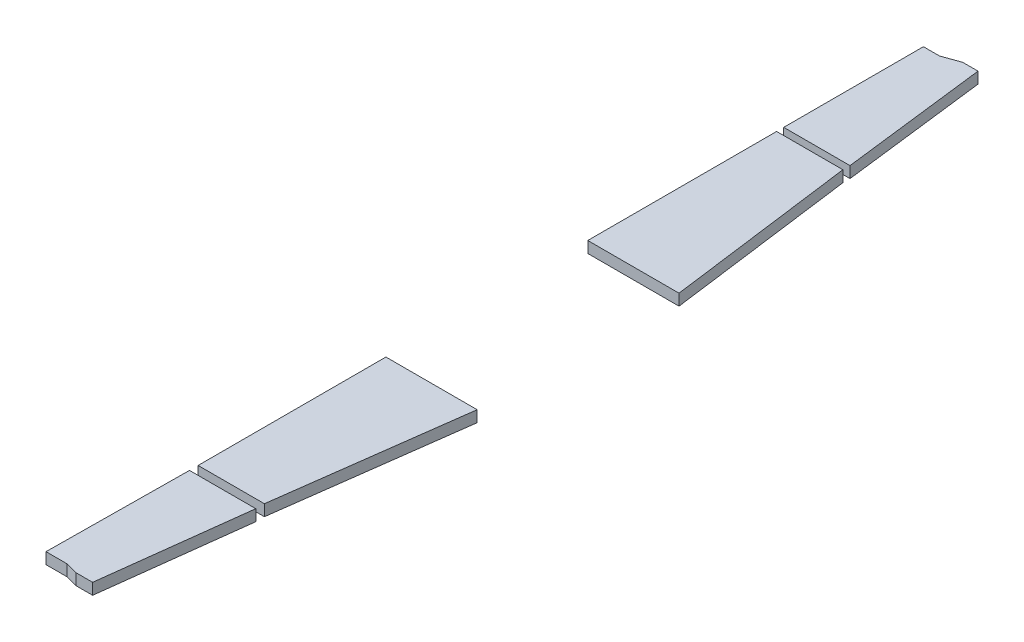
ISO-10303-21;
HEADER;
FILE_DESCRIPTION(('STEP AP214'),'2;1');
FILE_NAME('part.step','',(''),(''),'','','');
FILE_SCHEMA(('AUTOMOTIVE_DESIGN { 1 0 10303 214 1 1 1 1 }'));
ENDSEC;
DATA;
#1=APPLICATION_CONTEXT('core data for automotive mechanical design processes');
#2=APPLICATION_PROTOCOL_DEFINITION('international standard','automotive_design',2000,#1);
#3=PRODUCT_CONTEXT('',#1,'mechanical');
#4=PRODUCT('Part','Part','',(#3));
#5=PRODUCT_RELATED_PRODUCT_CATEGORY('part','',(#4));
#6=PRODUCT_DEFINITION_FORMATION('','',#4);
#7=PRODUCT_DEFINITION_CONTEXT('part definition',#1,'design');
#8=PRODUCT_DEFINITION('design','',#6,#7);
#9=PRODUCT_DEFINITION_SHAPE('','',#8);
#10=(LENGTH_UNIT() NAMED_UNIT(*) SI_UNIT(.MILLI.,.METRE.));
#11=(NAMED_UNIT(*) PLANE_ANGLE_UNIT() SI_UNIT($,.RADIAN.));
#12=(NAMED_UNIT(*) SI_UNIT($,.STERADIAN.) SOLID_ANGLE_UNIT());
#13=UNCERTAINTY_MEASURE_WITH_UNIT(LENGTH_MEASURE(1.E-05),#10,'distance_accuracy_value','');
#14=(GEOMETRIC_REPRESENTATION_CONTEXT(3) GLOBAL_UNCERTAINTY_ASSIGNED_CONTEXT((#13)) GLOBAL_UNIT_ASSIGNED_CONTEXT((#10,
#11,#12)) REPRESENTATION_CONTEXT('',''));
#15=CARTESIAN_POINT('',(0.,0.,0.));
#16=DIRECTION('',(0.,0.,1.));
#17=DIRECTION('',(1.,0.,0.));
#18=AXIS2_PLACEMENT_3D('',#15,#16,#17);
#19=CARTESIAN_POINT('',(1320.64914053354,304.8,10947.5154951929));
#20=DIRECTION('',(1.,0.,0.));
#21=DIRECTION('',(0.,0.,-1.));
#22=AXIS2_PLACEMENT_3D('',#19,#20,#21);
#23=PLANE('',#22);
#24=DIRECTION('',(0.,0.,1.));
#25=VECTOR('',#24,1.);
#26=CARTESIAN_POINT('',(1320.64914053354,0.,10947.5154951929));
#27=LINE('',#26,#25);
#28=CARTESIAN_POINT('',(1320.64914053354,0.,10947.5154951929));
#29=VERTEX_POINT('',#28);
#30=CARTESIAN_POINT('',(1320.64914053354,0.,16051.7646939314));
#31=VERTEX_POINT('',#30);
#32=EDGE_CURVE('E12',#29,#31,#27,.T.);
#33=ORIENTED_EDGE('',*,*,#32,.T.);
#34=DIRECTION('',(0.,-1.,0.));
#35=VECTOR('',#34,1.);
#36=CARTESIAN_POINT('',(1320.64914053354,304.8,16051.7646939314));
#37=LINE('',#36,#35);
#38=CARTESIAN_POINT('',(1320.64914053354,304.8,16051.7646939314));
#39=VERTEX_POINT('',#38);
#40=EDGE_CURVE('E171',#39,#31,#37,.T.);
#41=ORIENTED_EDGE('',*,*,#40,.F.);
#42=DIRECTION('',(0.,0.,1.));
#43=VECTOR('',#42,1.);
#44=CARTESIAN_POINT('',(1320.64914053354,304.8,10947.5154951929));
#45=LINE('',#44,#43);
#46=CARTESIAN_POINT('',(1320.64914053354,304.8,10947.5154951929));
#47=VERTEX_POINT('',#46);
#48=EDGE_CURVE('E100',#47,#39,#45,.T.);
#49=ORIENTED_EDGE('',*,*,#48,.F.);
#50=DIRECTION('',(0.,-1.,0.));
#51=VECTOR('',#50,1.);
#52=CARTESIAN_POINT('',(1320.64914053354,304.8,10947.5154951929));
#53=LINE('',#52,#51);
#54=EDGE_CURVE('E95',#47,#29,#53,.T.);
#55=ORIENTED_EDGE('',*,*,#54,.T.);
#56=EDGE_LOOP('',(#33,#41,#49,#55));
#57=FACE_BOUND('',#56,.T.);
#58=ADVANCED_FACE('F52',(#57),#23,.F.);
#59=CARTESIAN_POINT('',(1320.64914053354,304.8,16051.7646939314));
#60=DIRECTION('',(0.,0.,-1.));
#61=DIRECTION('',(-1.,0.,0.));
#62=AXIS2_PLACEMENT_3D('',#59,#60,#61);
#63=PLANE('',#62);
#64=DIRECTION('',(1.,0.,0.));
#65=VECTOR('',#64,1.);
#66=CARTESIAN_POINT('',(1320.64914053354,0.,16051.7646939314));
#67=LINE('',#66,#65);
#68=CARTESIAN_POINT('',(3787.29094804455,0.,16051.7646939314));
#69=VERTEX_POINT('',#68);
#70=EDGE_CURVE('E62',#31,#69,#67,.T.);
#71=ORIENTED_EDGE('',*,*,#70,.T.);
#72=DIRECTION('',(0.,-1.,0.));
#73=VECTOR('',#72,1.);
#74=CARTESIAN_POINT('',(3787.29094804455,304.8,16051.7646939314));
#75=LINE('',#74,#73);
#76=CARTESIAN_POINT('',(3787.29094804455,304.8,16051.7646939314));
#77=VERTEX_POINT('',#76);
#78=EDGE_CURVE('E160',#77,#69,#75,.T.);
#79=ORIENTED_EDGE('',*,*,#78,.F.);
#80=DIRECTION('',(1.,0.,0.));
#81=VECTOR('',#80,1.);
#82=CARTESIAN_POINT('',(1320.64914053354,304.8,16051.7646939314));
#83=LINE('',#82,#81);
#84=EDGE_CURVE('E165',#39,#77,#83,.T.);
#85=ORIENTED_EDGE('',*,*,#84,.F.);
#86=ORIENTED_EDGE('',*,*,#40,.T.);
#87=EDGE_LOOP('',(#71,#79,#85,#86));
#88=FACE_BOUND('',#87,.T.);
#89=ADVANCED_FACE('F112',(#88),#63,.F.);
#90=CARTESIAN_POINT('',(3787.29094804455,304.8,16051.7646939314));
#91=DIRECTION('',(-0.99136850616426,0.,0.131104862555301));
#92=DIRECTION('',(0.131104862555301,0.,0.99136850616426));
#93=AXIS2_PLACEMENT_3D('',#90,#91,#92);
#94=PLANE('',#93);
#95=DIRECTION('',(-0.131104862555301,0.,-0.99136850616426));
#96=VECTOR('',#95,1.);
#97=CARTESIAN_POINT('',(3787.29094804455,0.,16051.7646939314));
#98=LINE('',#97,#96);
#99=CARTESIAN_POINT('',(3112.27264204871,0.,10947.5154951929));
#100=VERTEX_POINT('',#99);
#101=EDGE_CURVE('E99',#69,#100,#98,.T.);
#102=ORIENTED_EDGE('',*,*,#101,.T.);
#103=DIRECTION('',(0.,-1.,0.));
#104=VECTOR('',#103,1.);
#105=CARTESIAN_POINT('',(3112.27264204871,304.8,10947.5154951929));
#106=LINE('',#105,#104);
#107=CARTESIAN_POINT('',(3112.27264204871,304.8,10947.5154951929));
#108=VERTEX_POINT('',#107);
#109=EDGE_CURVE('E98',#108,#100,#106,.T.);
#110=ORIENTED_EDGE('',*,*,#109,.F.);
#111=DIRECTION('',(-0.131104862555301,0.,-0.99136850616426));
#112=VECTOR('',#111,1.);
#113=CARTESIAN_POINT('',(3787.29094804455,304.8,16051.7646939314));
#114=LINE('',#113,#112);
#115=EDGE_CURVE('E168',#77,#108,#114,.T.);
#116=ORIENTED_EDGE('',*,*,#115,.F.);
#117=ORIENTED_EDGE('',*,*,#78,.T.);
#118=EDGE_LOOP('',(#102,#110,#116,#117));
#119=FACE_BOUND('',#118,.T.);
#120=ADVANCED_FACE('F117',(#119),#94,.F.);
#121=CARTESIAN_POINT('',(1320.64914053354,304.8,10947.5154951929));
#122=DIRECTION('',(0.,0.,1.));
#123=DIRECTION('',(1.,0.,0.));
#124=AXIS2_PLACEMENT_3D('',#121,#122,#123);
#125=PLANE('',#124);
#126=DIRECTION('',(-1.,0.,0.));
#127=VECTOR('',#126,1.);
#128=CARTESIAN_POINT('',(1320.64914053354,0.,10947.5154951929));
#129=LINE('',#128,#127);
#130=EDGE_CURVE('E91',#100,#29,#129,.T.);
#131=ORIENTED_EDGE('',*,*,#130,.T.);
#132=ORIENTED_EDGE('',*,*,#54,.F.);
#133=DIRECTION('',(-1.,0.,0.));
#134=VECTOR('',#133,1.);
#135=CARTESIAN_POINT('',(1320.64914053354,304.8,10947.5154951929));
#136=LINE('',#135,#134);
#137=EDGE_CURVE('E56',#108,#47,#136,.T.);
#138=ORIENTED_EDGE('',*,*,#137,.F.);
#139=ORIENTED_EDGE('',*,*,#109,.T.);
#140=EDGE_LOOP('',(#131,#132,#138,#139));
#141=FACE_BOUND('',#140,.T.);
#142=ADVANCED_FACE('F93',(#141),#125,.F.);
#143=CARTESIAN_POINT('',(0.,304.8,0.));
#144=DIRECTION('',(0.,1.,0.));
#145=DIRECTION('',(0.,0.,1.));
#146=AXIS2_PLACEMENT_3D('',#143,#144,#145);
#147=PLANE('',#146);
#148=ORIENTED_EDGE('',*,*,#48,.T.);
#149=ORIENTED_EDGE('',*,*,#84,.T.);
#150=ORIENTED_EDGE('',*,*,#115,.T.);
#151=ORIENTED_EDGE('',*,*,#137,.T.);
#152=EDGE_LOOP('',(#148,#149,#150,#151));
#153=FACE_BOUND('',#152,.T.);
#154=ADVANCED_FACE('F106',(#153),#147,.T.);
#155=CARTESIAN_POINT('',(0.,0.,0.));
#156=DIRECTION('',(0.,1.,0.));
#157=DIRECTION('',(0.,0.,1.));
#158=AXIS2_PLACEMENT_3D('',#155,#156,#157);
#159=PLANE('',#158);
#160=ORIENTED_EDGE('',*,*,#32,.F.);
#161=ORIENTED_EDGE('',*,*,#130,.F.);
#162=ORIENTED_EDGE('',*,*,#101,.F.);
#163=ORIENTED_EDGE('',*,*,#70,.F.);
#164=EDGE_LOOP('',(#160,#161,#162,#163));
#165=FACE_BOUND('',#164,.T.);
#166=ADVANCED_FACE('F54',(#165),#159,.F.);
#167=CLOSED_SHELL('',(#58,#89,#120,#142,#154,#166));
#168=MANIFOLD_SOLID_BREP('B2',#167);
#169=CARTESIAN_POINT('',(1320.64914053354,304.8,6979.23888497898));
#170=DIRECTION('',(1.,0.,0.));
#171=DIRECTION('',(0.,0.,-1.));
#172=AXIS2_PLACEMENT_3D('',#169,#170,#171);
#173=PLANE('',#172);
#174=DIRECTION('',(0.,0.,1.));
#175=VECTOR('',#174,1.);
#176=CARTESIAN_POINT('',(1320.64914053354,0.,6979.23888497898));
#177=LINE('',#176,#175);
#178=CARTESIAN_POINT('',(1320.64914053354,0.,6979.23888497898));
#179=VERTEX_POINT('',#178);
#180=CARTESIAN_POINT('',(1320.64914053354,0.,10754.9703962938));
#181=VERTEX_POINT('',#180);
#182=EDGE_CURVE('E263',#179,#181,#177,.T.);
#183=ORIENTED_EDGE('',*,*,#182,.T.);
#184=DIRECTION('',(0.,-1.,0.));
#185=VECTOR('',#184,1.);
#186=CARTESIAN_POINT('',(1320.64914053354,304.8,10754.9703962938));
#187=LINE('',#186,#185);
#188=CARTESIAN_POINT('',(1320.64914053354,304.8,10754.9703962938));
#189=VERTEX_POINT('',#188);
#190=EDGE_CURVE('E50',#189,#181,#187,.T.);
#191=ORIENTED_EDGE('',*,*,#190,.F.);
#192=DIRECTION('',(0.,0.,1.));
#193=VECTOR('',#192,1.);
#194=CARTESIAN_POINT('',(1320.64914053354,304.8,6979.23888497898));
#195=LINE('',#194,#193);
#196=CARTESIAN_POINT('',(1320.64914053354,304.8,6979.23888497898));
#197=VERTEX_POINT('',#196);
#198=EDGE_CURVE('E286',#197,#189,#195,.T.);
#199=ORIENTED_EDGE('',*,*,#198,.F.);
#200=DIRECTION('',(0.,-1.,0.));
#201=VECTOR('',#200,1.);
#202=CARTESIAN_POINT('',(1320.64914053354,304.8,6979.23888497898));
#203=LINE('',#202,#201);
#204=EDGE_CURVE('E285',#197,#179,#203,.T.);
#205=ORIENTED_EDGE('',*,*,#204,.T.);
#206=EDGE_LOOP('',(#183,#191,#199,#205));
#207=FACE_BOUND('',#206,.T.);
#208=ADVANCED_FACE('F186',(#207),#173,.F.);
#209=CARTESIAN_POINT('',(1320.64914053354,304.8,10754.9703962938));
#210=DIRECTION('',(0.,0.,-1.));
#211=DIRECTION('',(-1.,0.,0.));
#212=AXIS2_PLACEMENT_3D('',#209,#210,#211);
#213=PLANE('',#212);
#214=DIRECTION('',(1.,0.,0.));
#215=VECTOR('',#214,1.);
#216=CARTESIAN_POINT('',(1320.64914053354,0.,10754.9703962938));
#217=LINE('',#216,#215);
#218=CARTESIAN_POINT('',(3112.27264204871,0.,10754.9703962938));
#219=VERTEX_POINT('',#218);
#220=EDGE_CURVE('E253',#181,#219,#217,.T.);
#221=ORIENTED_EDGE('',*,*,#220,.T.);
#222=DIRECTION('',(0.,-1.,0.));
#223=VECTOR('',#222,1.);
#224=CARTESIAN_POINT('',(3112.27264204871,304.8,10754.9703962938));
#225=LINE('',#224,#223);
#226=CARTESIAN_POINT('',(3112.27264204871,304.8,10754.9703962938));
#227=VERTEX_POINT('',#226);
#228=EDGE_CURVE('E195',#227,#219,#225,.T.);
#229=ORIENTED_EDGE('',*,*,#228,.F.);
#230=DIRECTION('',(1.,0.,0.));
#231=VECTOR('',#230,1.);
#232=CARTESIAN_POINT('',(1320.64914053354,304.8,10754.9703962938));
#233=LINE('',#232,#231);
#234=EDGE_CURVE('E275',#189,#227,#233,.T.);
#235=ORIENTED_EDGE('',*,*,#234,.F.);
#236=ORIENTED_EDGE('',*,*,#190,.T.);
#237=EDGE_LOOP('',(#221,#229,#235,#236));
#238=FACE_BOUND('',#237,.T.);
#239=ADVANCED_FACE('F255',(#238),#213,.F.);
#240=CARTESIAN_POINT('',(3112.27264204871,304.8,10754.9703962938));
#241=DIRECTION('',(-0.992606761130583,0.,0.121374699826009));
#242=DIRECTION('',(0.121374699826009,0.,0.992606761130583));
#243=AXIS2_PLACEMENT_3D('',#240,#241,#242);
#244=PLANE('',#243);
#245=DIRECTION('',(-0.121374699826009,0.,-0.992606761130583));
#246=VECTOR('',#245,1.);
#247=CARTESIAN_POINT('',(3112.27264204871,0.,10754.9703962938));
#248=LINE('',#247,#246);
#249=CARTESIAN_POINT('',(2630.3586640753,0.,6813.86015251597));
#250=VERTEX_POINT('',#249);
#251=EDGE_CURVE('E262',#219,#250,#248,.T.);
#252=ORIENTED_EDGE('',*,*,#251,.T.);
#253=DIRECTION('',(0.,-1.,0.));
#254=VECTOR('',#253,1.);
#255=CARTESIAN_POINT('',(2630.3586640753,304.8,6813.86015251597));
#256=LINE('',#255,#254);
#257=CARTESIAN_POINT('',(2630.3586640753,304.8,6813.86015251597));
#258=VERTEX_POINT('',#257);
#259=EDGE_CURVE('E269',#258,#250,#256,.T.);
#260=ORIENTED_EDGE('',*,*,#259,.F.);
#261=DIRECTION('',(-0.121374699826009,0.,-0.992606761130583));
#262=VECTOR('',#261,1.);
#263=CARTESIAN_POINT('',(3112.27264204871,304.8,10754.9703962938));
#264=LINE('',#263,#262);
#265=EDGE_CURVE('E268',#227,#258,#264,.T.);
#266=ORIENTED_EDGE('',*,*,#265,.F.);
#267=ORIENTED_EDGE('',*,*,#228,.T.);
#268=EDGE_LOOP('',(#252,#260,#266,#267));
#269=FACE_BOUND('',#268,.T.);
#270=ADVANCED_FACE('F266',(#269),#244,.F.);
#271=CARTESIAN_POINT('',(2630.3586640753,304.8,6813.86015251597));
#272=DIRECTION('',(0.,0.,1.));
#273=DIRECTION('',(1.,0.,0.));
#274=AXIS2_PLACEMENT_3D('',#271,#272,#273);
#275=PLANE('',#274);
#276=DIRECTION('',(-1.,0.,0.));
#277=VECTOR('',#276,1.);
#278=CARTESIAN_POINT('',(2630.3586640753,0.,6813.86015251597));
#279=LINE('',#278,#277);
#280=CARTESIAN_POINT('',(2216.46089129112,0.,6813.86015251597));
#281=VERTEX_POINT('',#280);
#282=EDGE_CURVE('E238',#250,#281,#279,.T.);
#283=ORIENTED_EDGE('',*,*,#282,.T.);
#284=DIRECTION('',(0.,-1.,0.));
#285=VECTOR('',#284,1.);
#286=CARTESIAN_POINT('',(2216.46089129112,304.8,6813.86015251597));
#287=LINE('',#286,#285);
#288=CARTESIAN_POINT('',(2216.46089129112,304.8,6813.86015251597));
#289=VERTEX_POINT('',#288);
#290=EDGE_CURVE('E277',#289,#281,#287,.T.);
#291=ORIENTED_EDGE('',*,*,#290,.F.);
#292=DIRECTION('',(-1.,0.,0.));
#293=VECTOR('',#292,1.);
#294=CARTESIAN_POINT('',(2630.3586640753,304.8,6813.86015251597));
#295=LINE('',#294,#293);
#296=EDGE_CURVE('E278',#258,#289,#295,.T.);
#297=ORIENTED_EDGE('',*,*,#296,.F.);
#298=ORIENTED_EDGE('',*,*,#259,.T.);
#299=EDGE_LOOP('',(#283,#291,#297,#298));
#300=FACE_BOUND('',#299,.T.);
#301=ADVANCED_FACE('F295',(#300),#275,.F.);
#302=CARTESIAN_POINT('',(2216.46089129112,304.8,6813.86015251597));
#303=DIRECTION('',(0.336983148106975,0.,0.941510678586235));
#304=DIRECTION('',(0.941510678586235,0.,-0.336983148106975));
#305=AXIS2_PLACEMENT_3D('',#302,#303,#304);
#306=PLANE('',#305);
#307=DIRECTION('',(-0.941510678586235,0.,0.336983148106975));
#308=VECTOR('',#307,1.);
#309=CARTESIAN_POINT('',(2216.46089129112,0.,6813.86015251597));
#310=LINE('',#309,#308);
#311=CARTESIAN_POINT('',(1754.40264446285,0.,6979.23888497898));
#312=VERTEX_POINT('',#311);
#313=EDGE_CURVE('E230',#281,#312,#310,.T.);
#314=ORIENTED_EDGE('',*,*,#313,.T.);
#315=DIRECTION('',(0.,-1.,0.));
#316=VECTOR('',#315,1.);
#317=CARTESIAN_POINT('',(1754.40264446285,304.8,6979.23888497898));
#318=LINE('',#317,#316);
#319=CARTESIAN_POINT('',(1754.40264446285,304.8,6979.23888497898));
#320=VERTEX_POINT('',#319);
#321=EDGE_CURVE('E281',#320,#312,#318,.T.);
#322=ORIENTED_EDGE('',*,*,#321,.F.);
#323=DIRECTION('',(-0.941510678586235,0.,0.336983148106975));
#324=VECTOR('',#323,1.);
#325=CARTESIAN_POINT('',(2216.46089129112,304.8,6813.86015251597));
#326=LINE('',#325,#324);
#327=EDGE_CURVE('E208',#289,#320,#326,.T.);
#328=ORIENTED_EDGE('',*,*,#327,.F.);
#329=ORIENTED_EDGE('',*,*,#290,.T.);
#330=EDGE_LOOP('',(#314,#322,#328,#329));
#331=FACE_BOUND('',#330,.T.);
#332=ADVANCED_FACE('F293',(#331),#306,.F.);
#333=CARTESIAN_POINT('',(1754.40264446285,304.8,6979.23888497898));
#334=DIRECTION('',(0.,0.,1.));
#335=DIRECTION('',(1.,0.,0.));
#336=AXIS2_PLACEMENT_3D('',#333,#334,#335);
#337=PLANE('',#336);
#338=DIRECTION('',(-1.,0.,0.));
#339=VECTOR('',#338,1.);
#340=CARTESIAN_POINT('',(1754.40264446285,0.,6979.23888497898));
#341=LINE('',#340,#339);
#342=EDGE_CURVE('E220',#312,#179,#341,.T.);
#343=ORIENTED_EDGE('',*,*,#342,.T.);
#344=ORIENTED_EDGE('',*,*,#204,.F.);
#345=DIRECTION('',(-1.,0.,0.));
#346=VECTOR('',#345,1.);
#347=CARTESIAN_POINT('',(1754.40264446285,304.8,6979.23888497898));
#348=LINE('',#347,#346);
#349=EDGE_CURVE('E190',#320,#197,#348,.T.);
#350=ORIENTED_EDGE('',*,*,#349,.F.);
#351=ORIENTED_EDGE('',*,*,#321,.T.);
#352=EDGE_LOOP('',(#343,#344,#350,#351));
#353=FACE_BOUND('',#352,.T.);
#354=ADVANCED_FACE('F292',(#353),#337,.F.);
#355=CARTESIAN_POINT('',(0.,304.8,0.));
#356=DIRECTION('',(0.,1.,0.));
#357=DIRECTION('',(0.,0.,1.));
#358=AXIS2_PLACEMENT_3D('',#355,#356,#357);
#359=PLANE('',#358);
#360=ORIENTED_EDGE('',*,*,#198,.T.);
#361=ORIENTED_EDGE('',*,*,#234,.T.);
#362=ORIENTED_EDGE('',*,*,#265,.T.);
#363=ORIENTED_EDGE('',*,*,#296,.T.);
#364=ORIENTED_EDGE('',*,*,#327,.T.);
#365=ORIENTED_EDGE('',*,*,#349,.T.);
#366=EDGE_LOOP('',(#360,#361,#362,#363,#364,#365));
#367=FACE_BOUND('',#366,.T.);
#368=ADVANCED_FACE('F296',(#367),#359,.T.);
#369=CARTESIAN_POINT('',(0.,0.,0.));
#370=DIRECTION('',(0.,1.,0.));
#371=DIRECTION('',(0.,0.,1.));
#372=AXIS2_PLACEMENT_3D('',#369,#370,#371);
#373=PLANE('',#372);
#374=ORIENTED_EDGE('',*,*,#182,.F.);
#375=ORIENTED_EDGE('',*,*,#342,.F.);
#376=ORIENTED_EDGE('',*,*,#313,.F.);
#377=ORIENTED_EDGE('',*,*,#282,.F.);
#378=ORIENTED_EDGE('',*,*,#251,.F.);
#379=ORIENTED_EDGE('',*,*,#220,.F.);
#380=EDGE_LOOP('',(#374,#375,#376,#377,#378,#379));
#381=FACE_BOUND('',#380,.T.);
#382=ADVANCED_FACE('F188',(#381),#373,.F.);
#383=CLOSED_SHELL('',(#208,#239,#270,#301,#332,#354,#368,#382));
#384=MANIFOLD_SOLID_BREP('B6',#383);
#385=CARTESIAN_POINT('',(3112.27264204871,304.8,26816.2700937606));
#386=DIRECTION('',(0.,0.,1.));
#387=DIRECTION('',(1.,0.,0.));
#388=AXIS2_PLACEMENT_3D('',#385,#386,#387);
#389=PLANE('',#388);
#390=DIRECTION('',(-1.,0.,0.));
#391=VECTOR('',#390,1.);
#392=CARTESIAN_POINT('',(3112.27264204871,0.,26816.2700937606));
#393=LINE('',#392,#391);
#394=CARTESIAN_POINT('',(3112.27264204871,0.,26816.2700937606));
#395=VERTEX_POINT('',#394);
#396=CARTESIAN_POINT('',(1320.64914053354,0.,26816.2700937606));
#397=VERTEX_POINT('',#396);
#398=EDGE_CURVE('E184',#395,#397,#393,.T.);
#399=ORIENTED_EDGE('',*,*,#398,.T.);
#400=DIRECTION('',(0.,-1.,0.));
#401=VECTOR('',#400,1.);
#402=CARTESIAN_POINT('',(1320.64914053354,304.8,26816.2700937606));
#403=LINE('',#402,#401);
#404=CARTESIAN_POINT('',(1320.64914053354,304.8,26816.2700937606));
#405=VERTEX_POINT('',#404);
#406=EDGE_CURVE('E529',#405,#397,#403,.T.);
#407=ORIENTED_EDGE('',*,*,#406,.F.);
#408=DIRECTION('',(-1.,0.,0.));
#409=VECTOR('',#408,1.);
#410=CARTESIAN_POINT('',(3112.27264204871,304.8,26816.2700937606));
#411=LINE('',#410,#409);
#412=CARTESIAN_POINT('',(3112.27264204871,304.8,26816.2700937606));
#413=VERTEX_POINT('',#412);
#414=EDGE_CURVE('E432',#413,#405,#411,.T.);
#415=ORIENTED_EDGE('',*,*,#414,.F.);
#416=DIRECTION('',(0.,-1.,0.));
#417=VECTOR('',#416,1.);
#418=CARTESIAN_POINT('',(3112.27264204871,304.8,26816.2700937606));
#419=LINE('',#418,#417);
#420=EDGE_CURVE('E426',#413,#395,#419,.T.);
#421=ORIENTED_EDGE('',*,*,#420,.T.);
#422=EDGE_LOOP('',(#399,#407,#415,#421));
#423=FACE_BOUND('',#422,.T.);
#424=ADVANCED_FACE('F371',(#423),#389,.F.);
#425=CARTESIAN_POINT('',(1320.64914053354,304.8,26816.2700937606));
#426=DIRECTION('',(0.999951568964519,0.,0.00984173386136512));
#427=DIRECTION('',(0.00984173386136512,0.,-0.999951568964519));
#428=AXIS2_PLACEMENT_3D('',#425,#426,#427);
#429=PLANE('',#428);
#430=DIRECTION('',(-0.00984173386136512,0.,0.999951568964518));
#431=VECTOR('',#430,1.);
#432=CARTESIAN_POINT('',(1320.64914053354,0.,26816.2700937606));
#433=LINE('',#432,#431);
#434=CARTESIAN_POINT('',(1282.84528390286,0.,30657.2625736681));
#435=VERTEX_POINT('',#434);
#436=EDGE_CURVE('E381',#397,#435,#433,.T.);
#437=ORIENTED_EDGE('',*,*,#436,.T.);
#438=DIRECTION('',(0.,-1.,0.));
#439=VECTOR('',#438,1.);
#440=CARTESIAN_POINT('',(1282.84528390286,304.8,30657.2625736681));
#441=LINE('',#440,#439);
#442=CARTESIAN_POINT('',(1282.84528390286,304.8,30657.2625736681));
#443=VERTEX_POINT('',#442);
#444=EDGE_CURVE('E530',#443,#435,#441,.T.);
#445=ORIENTED_EDGE('',*,*,#444,.F.);
#446=DIRECTION('',(-0.00984173386136512,0.,0.999951568964518));
#447=VECTOR('',#446,1.);
#448=CARTESIAN_POINT('',(1320.64914053354,304.8,26816.2700937606));
#449=LINE('',#448,#447);
#450=EDGE_CURVE('E526',#405,#443,#449,.T.);
#451=ORIENTED_EDGE('',*,*,#450,.F.);
#452=ORIENTED_EDGE('',*,*,#406,.T.);
#453=EDGE_LOOP('',(#437,#445,#451,#452));
#454=FACE_BOUND('',#453,.T.);
#455=ADVANCED_FACE('F444',(#454),#429,.F.);
#456=CARTESIAN_POINT('',(1282.84528390286,304.8,30657.2625736681));
#457=DIRECTION('',(0.,0.,-1.));
#458=DIRECTION('',(-1.,0.,0.));
#459=AXIS2_PLACEMENT_3D('',#456,#457,#458);
#460=PLANE('',#459);
#461=DIRECTION('',(1.,0.,0.));
#462=VECTOR('',#461,1.);
#463=CARTESIAN_POINT('',(1282.84528390286,0.,30657.2625736681));
#464=LINE('',#463,#462);
#465=CARTESIAN_POINT('',(1854.1929152891,0.,30657.2625736681));
#466=VERTEX_POINT('',#465);
#467=EDGE_CURVE('E516',#435,#466,#464,.T.);
#468=ORIENTED_EDGE('',*,*,#467,.T.);
#469=DIRECTION('',(0.,-1.,0.));
#470=VECTOR('',#469,1.);
#471=CARTESIAN_POINT('',(1854.1929152891,304.8,30657.2625736681));
#472=LINE('',#471,#470);
#473=CARTESIAN_POINT('',(1854.1929152891,304.8,30657.2625736681));
#474=VERTEX_POINT('',#473);
#475=EDGE_CURVE('E533',#474,#466,#472,.T.);
#476=ORIENTED_EDGE('',*,*,#475,.F.);
#477=DIRECTION('',(1.,0.,0.));
#478=VECTOR('',#477,1.);
#479=CARTESIAN_POINT('',(1282.84528390286,304.8,30657.2625736681));
#480=LINE('',#479,#478);
#481=EDGE_CURVE('E525',#443,#474,#480,.T.);
#482=ORIENTED_EDGE('',*,*,#481,.F.);
#483=ORIENTED_EDGE('',*,*,#444,.T.);
#484=EDGE_LOOP('',(#468,#476,#482,#483));
#485=FACE_BOUND('',#484,.T.);
#486=ADVANCED_FACE('F449',(#485),#460,.F.);
#487=CARTESIAN_POINT('',(1854.1929152891,304.8,30657.2625736681));
#488=DIRECTION('',(0.261914926189569,0.,-0.965090965370163));
#489=DIRECTION('',(-0.965090965370163,0.,-0.261914926189569));
#490=AXIS2_PLACEMENT_3D('',#487,#488,#489);
#491=PLANE('',#490);
#492=DIRECTION('',(0.965090965370163,0.,0.261914926189569));
#493=VECTOR('',#492,1.);
#494=CARTESIAN_POINT('',(1854.1929152891,0.,30657.2625736681));
#495=LINE('',#494,#493);
#496=CARTESIAN_POINT('',(2175.97681743813,0.,30744.5911364715));
#497=VERTEX_POINT('',#496);
#498=EDGE_CURVE('E514',#466,#497,#495,.T.);
#499=ORIENTED_EDGE('',*,*,#498,.T.);
#500=DIRECTION('',(0.,-1.,0.));
#501=VECTOR('',#500,1.);
#502=CARTESIAN_POINT('',(2175.97681743813,304.8,30744.5911364715));
#503=LINE('',#502,#501);
#504=CARTESIAN_POINT('',(2175.97681743813,304.8,30744.5911364715));
#505=VERTEX_POINT('',#504);
#506=EDGE_CURVE('E512',#505,#497,#503,.T.);
#507=ORIENTED_EDGE('',*,*,#506,.F.);
#508=DIRECTION('',(0.965090965370163,0.,0.261914926189569));
#509=VECTOR('',#508,1.);
#510=CARTESIAN_POINT('',(1854.1929152891,304.8,30657.2625736681));
#511=LINE('',#510,#509);
#512=EDGE_CURVE('E520',#474,#505,#511,.T.);
#513=ORIENTED_EDGE('',*,*,#512,.F.);
#514=ORIENTED_EDGE('',*,*,#475,.T.);
#515=EDGE_LOOP('',(#499,#507,#513,#514));
#516=FACE_BOUND('',#515,.T.);
#517=ADVANCED_FACE('F455',(#516),#491,.F.);
#518=CARTESIAN_POINT('',(2175.97681743813,304.8,30744.5911364715));
#519=DIRECTION('',(0.,0.,-1.));
#520=DIRECTION('',(-1.,0.,0.));
#521=AXIS2_PLACEMENT_3D('',#518,#519,#520);
#522=PLANE('',#521);
#523=DIRECTION('',(1.,0.,0.));
#524=VECTOR('',#523,1.);
#525=CARTESIAN_POINT('',(2175.97681743813,0.,30744.5911364715));
#526=LINE('',#525,#524);
#527=CARTESIAN_POINT('',(2630.3586640753,0.,30744.5911364715));
#528=VERTEX_POINT('',#527);
#529=EDGE_CURVE('E431',#497,#528,#526,.T.);
#530=ORIENTED_EDGE('',*,*,#529,.T.);
#531=DIRECTION('',(0.,-1.,0.));
#532=VECTOR('',#531,1.);
#533=CARTESIAN_POINT('',(2630.3586640753,304.8,30744.5911364715));
#534=LINE('',#533,#532);
#535=CARTESIAN_POINT('',(2630.3586640753,304.8,30744.5911364715));
#536=VERTEX_POINT('',#535);
#537=EDGE_CURVE('E429',#536,#528,#534,.T.);
#538=ORIENTED_EDGE('',*,*,#537,.F.);
#539=DIRECTION('',(1.,0.,0.));
#540=VECTOR('',#539,1.);
#541=CARTESIAN_POINT('',(2175.97681743813,304.8,30744.5911364715));
#542=LINE('',#541,#540);
#543=EDGE_CURVE('E523',#505,#536,#542,.T.);
#544=ORIENTED_EDGE('',*,*,#543,.F.);
#545=ORIENTED_EDGE('',*,*,#506,.T.);
#546=EDGE_LOOP('',(#530,#538,#544,#545));
#547=FACE_BOUND('',#546,.T.);
#548=ADVANCED_FACE('F459',(#547),#522,.F.);
#549=CARTESIAN_POINT('',(2630.3586640753,304.8,30744.5911364715));
#550=DIRECTION('',(-0.992559080159297,0.,-0.12176400286345));
#551=DIRECTION('',(-0.12176400286345,0.,0.992559080159297));
#552=AXIS2_PLACEMENT_3D('',#549,#550,#551);
#553=PLANE('',#552);
#554=DIRECTION('',(0.12176400286345,0.,-0.992559080159297));
#555=VECTOR('',#554,1.);
#556=CARTESIAN_POINT('',(2630.3586640753,0.,30744.5911364715));
#557=LINE('',#556,#555);
#558=EDGE_CURVE('E422',#528,#395,#557,.T.);
#559=ORIENTED_EDGE('',*,*,#558,.T.);
#560=ORIENTED_EDGE('',*,*,#420,.F.);
#561=DIRECTION('',(0.12176400286345,0.,-0.992559080159297));
#562=VECTOR('',#561,1.);
#563=CARTESIAN_POINT('',(2630.3586640753,304.8,30744.5911364715));
#564=LINE('',#563,#562);
#565=EDGE_CURVE('E375',#536,#413,#564,.T.);
#566=ORIENTED_EDGE('',*,*,#565,.F.);
#567=ORIENTED_EDGE('',*,*,#537,.T.);
#568=EDGE_LOOP('',(#559,#560,#566,#567));
#569=FACE_BOUND('',#568,.T.);
#570=ADVANCED_FACE('F424',(#569),#553,.F.);
#571=CARTESIAN_POINT('',(0.,304.8,0.));
#572=DIRECTION('',(0.,1.,0.));
#573=DIRECTION('',(0.,0.,1.));
#574=AXIS2_PLACEMENT_3D('',#571,#572,#573);
#575=PLANE('',#574);
#576=ORIENTED_EDGE('',*,*,#414,.T.);
#577=ORIENTED_EDGE('',*,*,#450,.T.);
#578=ORIENTED_EDGE('',*,*,#481,.T.);
#579=ORIENTED_EDGE('',*,*,#512,.T.);
#580=ORIENTED_EDGE('',*,*,#543,.T.);
#581=ORIENTED_EDGE('',*,*,#565,.T.);
#582=EDGE_LOOP('',(#576,#577,#578,#579,#580,#581));
#583=FACE_BOUND('',#582,.T.);
#584=ADVANCED_FACE('F438',(#583),#575,.T.);
#585=CARTESIAN_POINT('',(0.,0.,0.));
#586=DIRECTION('',(0.,1.,0.));
#587=DIRECTION('',(0.,0.,1.));
#588=AXIS2_PLACEMENT_3D('',#585,#586,#587);
#589=PLANE('',#588);
#590=ORIENTED_EDGE('',*,*,#398,.F.);
#591=ORIENTED_EDGE('',*,*,#558,.F.);
#592=ORIENTED_EDGE('',*,*,#529,.F.);
#593=ORIENTED_EDGE('',*,*,#498,.F.);
#594=ORIENTED_EDGE('',*,*,#467,.F.);
#595=ORIENTED_EDGE('',*,*,#436,.F.);
#596=EDGE_LOOP('',(#590,#591,#592,#593,#594,#595));
#597=FACE_BOUND('',#596,.T.);
#598=ADVANCED_FACE('F373',(#597),#589,.F.);
#599=CLOSED_SHELL('',(#424,#455,#486,#517,#548,#570,#584,#598));
#600=MANIFOLD_SOLID_BREP('B44',#599);
#601=CARTESIAN_POINT('',(1320.64914053354,304.8,21507.5384689331));
#602=DIRECTION('',(0.,0.,1.));
#603=DIRECTION('',(1.,0.,0.));
#604=AXIS2_PLACEMENT_3D('',#601,#602,#603);
#605=PLANE('',#604);
#606=DIRECTION('',(-1.,0.,0.));
#607=VECTOR('',#606,1.);
#608=CARTESIAN_POINT('',(1320.64914053354,0.,21507.5384689331));
#609=LINE('',#608,#607);
#610=CARTESIAN_POINT('',(3787.29094804445,0.,21507.5384689331));
#611=VERTEX_POINT('',#610);
#612=CARTESIAN_POINT('',(1320.64914053354,0.,21507.5384689331));
#613=VERTEX_POINT('',#612);
#614=EDGE_CURVE('E369',#611,#613,#609,.T.);
#615=ORIENTED_EDGE('',*,*,#614,.T.);
#616=DIRECTION('',(0.,-1.,0.));
#617=VECTOR('',#616,1.);
#618=CARTESIAN_POINT('',(1320.64914053354,304.8,21507.5384689331));
#619=LINE('',#618,#617);
#620=CARTESIAN_POINT('',(1320.64914053354,304.8,21507.5384689331));
#621=VERTEX_POINT('',#620);
#622=EDGE_CURVE('E669',#621,#613,#619,.T.);
#623=ORIENTED_EDGE('',*,*,#622,.F.);
#624=DIRECTION('',(-1.,0.,0.));
#625=VECTOR('',#624,1.);
#626=CARTESIAN_POINT('',(1320.64914053354,304.8,21507.5384689331));
#627=LINE('',#626,#625);
#628=CARTESIAN_POINT('',(3787.29094804445,304.8,21507.5384689331));
#629=VERTEX_POINT('',#628);
#630=EDGE_CURVE('E595',#629,#621,#627,.T.);
#631=ORIENTED_EDGE('',*,*,#630,.F.);
#632=DIRECTION('',(0.,-1.,0.));
#633=VECTOR('',#632,1.);
#634=CARTESIAN_POINT('',(3787.29094804445,304.8,21507.5384689331));
#635=LINE('',#634,#633);
#636=EDGE_CURVE('E590',#629,#611,#635,.T.);
#637=ORIENTED_EDGE('',*,*,#636,.T.);
#638=EDGE_LOOP('',(#615,#623,#631,#637));
#639=FACE_BOUND('',#638,.T.);
#640=ADVANCED_FACE('F547',(#639),#605,.F.);
#641=CARTESIAN_POINT('',(1320.64914053354,304.8,21507.5384689331));
#642=DIRECTION('',(1.,0.,0.));
#643=DIRECTION('',(0.,0.,-1.));
#644=AXIS2_PLACEMENT_3D('',#641,#642,#643);
#645=PLANE('',#644);
#646=DIRECTION('',(0.,0.,1.));
#647=VECTOR('',#646,1.);
#648=CARTESIAN_POINT('',(1320.64914053354,0.,21507.5384689331));
#649=LINE('',#648,#647);
#650=CARTESIAN_POINT('',(1320.64914053354,0.,26583.606940771));
#651=VERTEX_POINT('',#650);
#652=EDGE_CURVE('E557',#613,#651,#649,.T.);
#653=ORIENTED_EDGE('',*,*,#652,.T.);
#654=DIRECTION('',(0.,-1.,0.));
#655=VECTOR('',#654,1.);
#656=CARTESIAN_POINT('',(1320.64914053354,304.8,26583.606940771));
#657=LINE('',#656,#655);
#658=CARTESIAN_POINT('',(1320.64914053354,304.8,26583.606940771));
#659=VERTEX_POINT('',#658);
#660=EDGE_CURVE('E658',#659,#651,#657,.T.);
#661=ORIENTED_EDGE('',*,*,#660,.F.);
#662=DIRECTION('',(0.,0.,1.));
#663=VECTOR('',#662,1.);
#664=CARTESIAN_POINT('',(1320.64914053354,304.8,21507.5384689331));
#665=LINE('',#664,#663);
#666=EDGE_CURVE('E663',#621,#659,#665,.T.);
#667=ORIENTED_EDGE('',*,*,#666,.F.);
#668=ORIENTED_EDGE('',*,*,#622,.T.);
#669=EDGE_LOOP('',(#653,#661,#667,#668));
#670=FACE_BOUND('',#669,.T.);
#671=ADVANCED_FACE('F607',(#670),#645,.F.);
#672=CARTESIAN_POINT('',(3112.27264204871,304.8,26583.606940771));
#673=DIRECTION('',(0.,0.,-1.));
#674=DIRECTION('',(-1.,0.,0.));
#675=AXIS2_PLACEMENT_3D('',#672,#673,#674);
#676=PLANE('',#675);
#677=DIRECTION('',(1.,0.,0.));
#678=VECTOR('',#677,1.);
#679=CARTESIAN_POINT('',(3112.27264204871,0.,26583.606940771));
#680=LINE('',#679,#678);
#681=CARTESIAN_POINT('',(3112.27264204871,0.,26583.606940771));
#682=VERTEX_POINT('',#681);
#683=EDGE_CURVE('E594',#651,#682,#680,.T.);
#684=ORIENTED_EDGE('',*,*,#683,.T.);
#685=DIRECTION('',(0.,-1.,0.));
#686=VECTOR('',#685,1.);
#687=CARTESIAN_POINT('',(3112.27264204871,304.8,26583.606940771));
#688=LINE('',#687,#686);
#689=CARTESIAN_POINT('',(3112.27264204871,304.8,26583.606940771));
#690=VERTEX_POINT('',#689);
#691=EDGE_CURVE('E593',#690,#682,#688,.T.);
#692=ORIENTED_EDGE('',*,*,#691,.F.);
#693=DIRECTION('',(1.,0.,0.));
#694=VECTOR('',#693,1.);
#695=CARTESIAN_POINT('',(1610.94931042528,304.8,26583.606940771));
#696=LINE('',#695,#694);
#697=EDGE_CURVE('E666',#659,#690,#696,.T.);
#698=ORIENTED_EDGE('',*,*,#697,.F.);
#699=ORIENTED_EDGE('',*,*,#660,.T.);
#700=EDGE_LOOP('',(#684,#692,#698,#699));
#701=FACE_BOUND('',#700,.T.);
#702=ADVANCED_FACE('F612',(#701),#676,.F.);
#703=CARTESIAN_POINT('',(3787.29094804445,304.8,21507.5384689331));
#704=DIRECTION('',(-0.991273655807555,0.,-0.13182010204034));
#705=DIRECTION('',(-0.13182010204034,0.,0.991273655807555));
#706=AXIS2_PLACEMENT_3D('',#703,#704,#705);
#707=PLANE('',#706);
#708=DIRECTION('',(0.13182010204034,0.,-0.991273655807555));
#709=VECTOR('',#708,1.);
#710=CARTESIAN_POINT('',(3787.29094804445,0.,21507.5384689331));
#711=LINE('',#710,#709);
#712=EDGE_CURVE('E586',#682,#611,#711,.T.);
#713=ORIENTED_EDGE('',*,*,#712,.T.);
#714=ORIENTED_EDGE('',*,*,#636,.F.);
#715=DIRECTION('',(0.13182010204034,0.,-0.991273655807555));
#716=VECTOR('',#715,1.);
#717=CARTESIAN_POINT('',(3787.29094804445,304.8,21507.5384689331));
#718=LINE('',#717,#716);
#719=EDGE_CURVE('E551',#690,#629,#718,.T.);
#720=ORIENTED_EDGE('',*,*,#719,.F.);
#721=ORIENTED_EDGE('',*,*,#691,.T.);
#722=EDGE_LOOP('',(#713,#714,#720,#721));
#723=FACE_BOUND('',#722,.T.);
#724=ADVANCED_FACE('F588',(#723),#707,.F.);
#725=CARTESIAN_POINT('',(0.,304.8,0.));
#726=DIRECTION('',(0.,-1.,0.));
#727=DIRECTION('',(0.,0.,-1.));
#728=AXIS2_PLACEMENT_3D('',#725,#726,#727);
#729=PLANE('',#728);
#730=ORIENTED_EDGE('',*,*,#630,.T.);
#731=ORIENTED_EDGE('',*,*,#666,.T.);
#732=ORIENTED_EDGE('',*,*,#697,.T.);
#733=ORIENTED_EDGE('',*,*,#719,.T.);
#734=EDGE_LOOP('',(#730,#731,#732,#733));
#735=FACE_BOUND('',#734,.T.);
#736=ADVANCED_FACE('F601',(#735),#729,.F.);
#737=CARTESIAN_POINT('',(0.,0.,0.));
#738=DIRECTION('',(0.,-1.,0.));
#739=DIRECTION('',(0.,0.,-1.));
#740=AXIS2_PLACEMENT_3D('',#737,#738,#739);
#741=PLANE('',#740);
#742=ORIENTED_EDGE('',*,*,#614,.F.);
#743=ORIENTED_EDGE('',*,*,#712,.F.);
#744=ORIENTED_EDGE('',*,*,#683,.F.);
#745=ORIENTED_EDGE('',*,*,#652,.F.);
#746=EDGE_LOOP('',(#742,#743,#744,#745));
#747=FACE_BOUND('',#746,.T.);
#748=ADVANCED_FACE('F549',(#747),#741,.T.);
#749=CLOSED_SHELL('',(#640,#671,#702,#724,#736,#748));
#750=MANIFOLD_SOLID_BREP('B178',#749);
#751=ADVANCED_BREP_SHAPE_REPRESENTATION('',(#18,#168,#384,#600,#750),#14);
#752=SHAPE_DEFINITION_REPRESENTATION(#9,#751);
ENDSEC;
END-ISO-10303-21;
